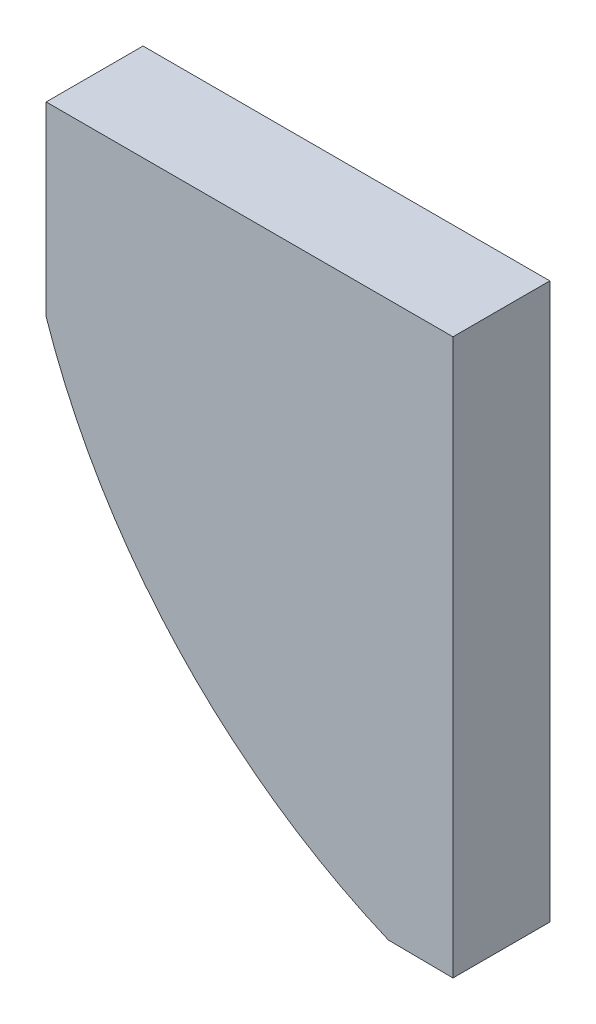
ISO-10303-21;
HEADER;
FILE_DESCRIPTION(('STEP AP214'),'2;1');
FILE_NAME('part.step','',(''),(''),'','','');
FILE_SCHEMA(('AUTOMOTIVE_DESIGN { 1 0 10303 214 1 1 1 1 }'));
ENDSEC;
DATA;
#1=APPLICATION_CONTEXT('core data for automotive mechanical design processes');
#2=APPLICATION_PROTOCOL_DEFINITION('international standard','automotive_design',2000,#1);
#3=PRODUCT_CONTEXT('',#1,'mechanical');
#4=PRODUCT('Part','Part','',(#3));
#5=PRODUCT_RELATED_PRODUCT_CATEGORY('part','',(#4));
#6=PRODUCT_DEFINITION_FORMATION('','',#4);
#7=PRODUCT_DEFINITION_CONTEXT('part definition',#1,'design');
#8=PRODUCT_DEFINITION('design','',#6,#7);
#9=PRODUCT_DEFINITION_SHAPE('','',#8);
#10=(LENGTH_UNIT() NAMED_UNIT(*) SI_UNIT(.MILLI.,.METRE.));
#11=(NAMED_UNIT(*) PLANE_ANGLE_UNIT() SI_UNIT($,.RADIAN.));
#12=(NAMED_UNIT(*) SI_UNIT($,.STERADIAN.) SOLID_ANGLE_UNIT());
#13=UNCERTAINTY_MEASURE_WITH_UNIT(LENGTH_MEASURE(1.E-05),#10,'distance_accuracy_value','');
#14=(GEOMETRIC_REPRESENTATION_CONTEXT(3) GLOBAL_UNCERTAINTY_ASSIGNED_CONTEXT((#13)) GLOBAL_UNIT_ASSIGNED_CONTEXT((#10,
#11,#12)) REPRESENTATION_CONTEXT('',''));
#15=CARTESIAN_POINT('',(0.,0.,0.));
#16=DIRECTION('',(0.,0.,1.));
#17=DIRECTION('',(1.,0.,0.));
#18=AXIS2_PLACEMENT_3D('',#15,#16,#17);
#19=CARTESIAN_POINT('',(-160.92418092877,-159.608706739523,15.));
#20=DIRECTION('',(1.,0.,0.));
#21=DIRECTION('',(0.,1.,0.));
#22=AXIS2_PLACEMENT_3D('',#19,#20,#21);
#23=PLANE('',#22);
#24=DIRECTION('',(0.,-1.,0.));
#25=VECTOR('',#24,1.);
#26=CARTESIAN_POINT('',(-160.92418092877,-159.608706739523,0.));
#27=LINE('',#26,#25);
#28=CARTESIAN_POINT('',(-160.92418092877,-159.608706739523,0.));
#29=VERTEX_POINT('',#28);
#30=CARTESIAN_POINT('',(-160.92418092877,-188.436332042505,0.));
#31=VERTEX_POINT('',#30);
#32=EDGE_CURVE('E120',#29,#31,#27,.T.);
#33=ORIENTED_EDGE('',*,*,#32,.T.);
#34=DIRECTION('',(0.,0.,-1.));
#35=VECTOR('',#34,1.);
#36=CARTESIAN_POINT('',(-160.92418092877,-188.436332042505,15.));
#37=LINE('',#36,#35);
#38=CARTESIAN_POINT('',(-160.92418092877,-188.436332042505,15.));
#39=VERTEX_POINT('',#38);
#40=EDGE_CURVE('E11',#39,#31,#37,.T.);
#41=ORIENTED_EDGE('',*,*,#40,.F.);
#42=DIRECTION('',(0.,-1.,0.));
#43=VECTOR('',#42,1.);
#44=CARTESIAN_POINT('',(-160.92418092877,-159.608706739523,15.));
#45=LINE('',#44,#43);
#46=CARTESIAN_POINT('',(-160.92418092877,-159.608706739523,15.));
#47=VERTEX_POINT('',#46);
#48=EDGE_CURVE('E114',#47,#39,#45,.T.);
#49=ORIENTED_EDGE('',*,*,#48,.F.);
#50=DIRECTION('',(0.,0.,-1.));
#51=VECTOR('',#50,1.);
#52=CARTESIAN_POINT('',(-160.92418092877,-159.608706739523,15.));
#53=LINE('',#52,#51);
#54=EDGE_CURVE('E119',#47,#29,#53,.T.);
#55=ORIENTED_EDGE('',*,*,#54,.T.);
#56=EDGE_LOOP('',(#33,#41,#49,#55));
#57=FACE_BOUND('',#56,.T.);
#58=ADVANCED_FACE('F33',(#57),#23,.F.);
#59=CARTESIAN_POINT('',(-70.9241809287697,-158.022519391014,15.));
#60=DIRECTION('',(0.,0.,-1.));
#61=DIRECTION('',(-1.,0.,0.));
#62=AXIS2_PLACEMENT_3D('',#59,#60,#61);
#63=CYLINDRICAL_SURFACE('',#62,95.);
#64=CARTESIAN_POINT('',(-70.9241809287697,-158.022519391014,0.));
#65=DIRECTION('',(0.,0.,1.));
#66=DIRECTION('',(1.,0.,0.));
#67=AXIS2_PLACEMENT_3D('',#64,#65,#66);
#68=CIRCLE('',#67,95.);
#69=CARTESIAN_POINT('',(-107.92418092877,-245.521090807923,0.));
#70=VERTEX_POINT('',#69);
#71=EDGE_CURVE('E123',#31,#70,#68,.T.);
#72=ORIENTED_EDGE('',*,*,#71,.T.);
#73=DIRECTION('',(0.,0.,-1.));
#74=VECTOR('',#73,1.);
#75=CARTESIAN_POINT('',(-107.92418092877,-245.521090807923,15.));
#76=LINE('',#75,#74);
#77=CARTESIAN_POINT('',(-107.92418092877,-245.521090807923,15.));
#78=VERTEX_POINT('',#77);
#79=EDGE_CURVE('E40',#78,#70,#76,.T.);
#80=ORIENTED_EDGE('',*,*,#79,.F.);
#81=CARTESIAN_POINT('',(-70.9241809287697,-158.022519391014,15.));
#82=DIRECTION('',(0.,0.,1.));
#83=DIRECTION('',(1.,0.,0.));
#84=AXIS2_PLACEMENT_3D('',#81,#82,#83);
#85=CIRCLE('',#84,95.);
#86=EDGE_CURVE('E88',#39,#78,#85,.T.);
#87=ORIENTED_EDGE('',*,*,#86,.F.);
#88=ORIENTED_EDGE('',*,*,#40,.T.);
#89=EDGE_LOOP('',(#72,#80,#87,#88));
#90=FACE_BOUND('',#89,.T.);
#91=ADVANCED_FACE('F132',(#90),#63,.T.);
#92=CARTESIAN_POINT('',(-97.9241809287696,-245.608706739523,15.));
#93=DIRECTION('',(-0.00876125688520129,-0.999961619452362,0.));
#94=DIRECTION('',(0.999961619452363,-0.00876125688520129,0.));
#95=AXIS2_PLACEMENT_3D('',#92,#93,#94);
#96=PLANE('',#95);
#97=DIRECTION('',(-0.999961619452363,0.00876125688520129,0.));
#98=VECTOR('',#97,1.);
#99=CARTESIAN_POINT('',(-97.9241809287696,-245.608706739523,0.));
#100=LINE('',#99,#98);
#101=CARTESIAN_POINT('',(-97.9241809287696,-245.608706739523,0.));
#102=VERTEX_POINT('',#101);
#103=EDGE_CURVE('E103',#102,#70,#100,.T.);
#104=ORIENTED_EDGE('',*,*,#103,.F.);
#105=DIRECTION('',(0.,0.,-1.));
#106=VECTOR('',#105,1.);
#107=CARTESIAN_POINT('',(-97.9241809287696,-245.608706739523,15.));
#108=LINE('',#107,#106);
#109=CARTESIAN_POINT('',(-97.9241809287696,-245.608706739523,15.));
#110=VERTEX_POINT('',#109);
#111=EDGE_CURVE('E97',#110,#102,#108,.T.);
#112=ORIENTED_EDGE('',*,*,#111,.F.);
#113=DIRECTION('',(-0.999961619452363,0.00876125688520129,0.));
#114=VECTOR('',#113,1.);
#115=CARTESIAN_POINT('',(-97.9241809287696,-245.608706739523,15.));
#116=LINE('',#115,#114);
#117=EDGE_CURVE('E101',#110,#78,#116,.T.);
#118=ORIENTED_EDGE('',*,*,#117,.T.);
#119=ORIENTED_EDGE('',*,*,#79,.T.);
#120=EDGE_LOOP('',(#104,#112,#118,#119));
#121=FACE_BOUND('',#120,.T.);
#122=ADVANCED_FACE('F99',(#121),#96,.T.);
#123=CARTESIAN_POINT('',(-97.9241809287696,-245.608706739523,15.));
#124=DIRECTION('',(-1.,0.,0.));
#125=DIRECTION('',(0.,-1.,0.));
#126=AXIS2_PLACEMENT_3D('',#123,#124,#125);
#127=PLANE('',#126);
#128=DIRECTION('',(0.,1.,0.));
#129=VECTOR('',#128,1.);
#130=CARTESIAN_POINT('',(-97.9241809287696,-245.608706739523,0.));
#131=LINE('',#130,#129);
#132=CARTESIAN_POINT('',(-97.9241809287696,-159.608706739523,0.));
#133=VERTEX_POINT('',#132);
#134=EDGE_CURVE('E128',#102,#133,#131,.T.);
#135=ORIENTED_EDGE('',*,*,#134,.T.);
#136=DIRECTION('',(0.,0.,-1.));
#137=VECTOR('',#136,1.);
#138=CARTESIAN_POINT('',(-97.9241809287696,-159.608706739523,15.));
#139=LINE('',#138,#137);
#140=CARTESIAN_POINT('',(-97.9241809287696,-159.608706739523,15.));
#141=VERTEX_POINT('',#140);
#142=EDGE_CURVE('E106',#141,#133,#139,.T.);
#143=ORIENTED_EDGE('',*,*,#142,.F.);
#144=DIRECTION('',(0.,1.,0.));
#145=VECTOR('',#144,1.);
#146=CARTESIAN_POINT('',(-97.9241809287696,-245.608706739523,15.));
#147=LINE('',#146,#145);
#148=EDGE_CURVE('E109',#110,#141,#147,.T.);
#149=ORIENTED_EDGE('',*,*,#148,.F.);
#150=ORIENTED_EDGE('',*,*,#111,.T.);
#151=EDGE_LOOP('',(#135,#143,#149,#150));
#152=FACE_BOUND('',#151,.T.);
#153=ADVANCED_FACE('F110',(#152),#127,.F.);
#154=CARTESIAN_POINT('',(-97.9241809287696,-159.608706739523,15.));
#155=DIRECTION('',(0.,-1.,0.));
#156=DIRECTION('',(0.,0.,-1.));
#157=AXIS2_PLACEMENT_3D('',#154,#155,#156);
#158=PLANE('',#157);
#159=DIRECTION('',(-1.,0.,0.));
#160=VECTOR('',#159,1.);
#161=CARTESIAN_POINT('',(-97.9241809287696,-159.608706739523,0.));
#162=LINE('',#161,#160);
#163=EDGE_CURVE('E80',#133,#29,#162,.T.);
#164=ORIENTED_EDGE('',*,*,#163,.T.);
#165=ORIENTED_EDGE('',*,*,#54,.F.);
#166=DIRECTION('',(-1.,0.,0.));
#167=VECTOR('',#166,1.);
#168=CARTESIAN_POINT('',(-97.9241809287696,-159.608706739523,15.));
#169=LINE('',#168,#167);
#170=EDGE_CURVE('E56',#141,#47,#169,.T.);
#171=ORIENTED_EDGE('',*,*,#170,.F.);
#172=ORIENTED_EDGE('',*,*,#142,.T.);
#173=EDGE_LOOP('',(#164,#165,#171,#172));
#174=FACE_BOUND('',#173,.T.);
#175=ADVANCED_FACE('F137',(#174),#158,.F.);
#176=CARTESIAN_POINT('',(-70.9241809287697,-158.022519391014,15.));
#177=DIRECTION('',(0.,0.,1.));
#178=DIRECTION('',(1.,0.,0.));
#179=AXIS2_PLACEMENT_3D('',#176,#177,#178);
#180=PLANE('',#179);
#181=ORIENTED_EDGE('',*,*,#48,.T.);
#182=ORIENTED_EDGE('',*,*,#86,.T.);
#183=ORIENTED_EDGE('',*,*,#117,.F.);
#184=ORIENTED_EDGE('',*,*,#148,.T.);
#185=ORIENTED_EDGE('',*,*,#170,.T.);
#186=EDGE_LOOP('',(#181,#182,#183,#184,#185));
#187=FACE_BOUND('',#186,.T.);
#188=ADVANCED_FACE('F112',(#187),#180,.T.);
#189=CARTESIAN_POINT('',(-70.9241809287697,-158.022519391014,0.));
#190=DIRECTION('',(0.,0.,1.));
#191=DIRECTION('',(1.,0.,0.));
#192=AXIS2_PLACEMENT_3D('',#189,#190,#191);
#193=PLANE('',#192);
#194=DIRECTION('',(-1.,0.,0.));
#195=VECTOR('',#194,1.);
#196=CARTESIAN_POINT('',(-97.9241809287696,-164.608706739523,0.));
#197=LINE('',#196,#195);
#198=CARTESIAN_POINT('',(-102.92418092877,-164.608706739523,0.));
#199=VERTEX_POINT('',#198);
#200=CARTESIAN_POINT('',(-155.92418092877,-164.608706739523,0.));
#201=VERTEX_POINT('',#200);
#202=EDGE_CURVE('E149',#199,#201,#197,.T.);
#203=ORIENTED_EDGE('',*,*,#202,.T.);
#204=DIRECTION('',(0.,-1.,0.));
#205=VECTOR('',#204,1.);
#206=CARTESIAN_POINT('',(-155.92418092877,-159.608706739523,0.));
#207=LINE('',#206,#205);
#208=CARTESIAN_POINT('',(-155.92418092877,-187.602918306512,0.));
#209=VERTEX_POINT('',#208);
#210=EDGE_CURVE('E144',#201,#209,#207,.T.);
#211=ORIENTED_EDGE('',*,*,#210,.T.);
#212=CARTESIAN_POINT('',(-70.9241809287697,-158.022519391014,0.));
#213=DIRECTION('',(0.,0.,1.));
#214=DIRECTION('',(1.,0.,0.));
#215=AXIS2_PLACEMENT_3D('',#212,#213,#214);
#216=CIRCLE('',#215,90.);
#217=CARTESIAN_POINT('',(-106.875555950009,-240.530086523261,0.));
#218=VERTEX_POINT('',#217);
#219=EDGE_CURVE('E141',#209,#218,#216,.T.);
#220=ORIENTED_EDGE('',*,*,#219,.T.);
#221=DIRECTION('',(-0.999961619452363,0.00876125688520129,0.));
#222=VECTOR('',#221,1.);
#223=CARTESIAN_POINT('',(-97.8803746443436,-240.608898642261,0.));
#224=LINE('',#223,#222);
#225=CARTESIAN_POINT('',(-102.92418092877,-240.564706863619,0.));
#226=VERTEX_POINT('',#225);
#227=EDGE_CURVE('E47',#226,#218,#224,.T.);
#228=ORIENTED_EDGE('',*,*,#227,.F.);
#229=DIRECTION('',(0.,1.,0.));
#230=VECTOR('',#229,1.);
#231=CARTESIAN_POINT('',(-102.92418092877,-245.608706739523,0.));
#232=LINE('',#231,#230);
#233=EDGE_CURVE('E146',#226,#199,#232,.T.);
#234=ORIENTED_EDGE('',*,*,#233,.T.);
#235=EDGE_LOOP('',(#203,#211,#220,#228,#234));
#236=FACE_BOUND('',#235,.T.);
#237=ORIENTED_EDGE('',*,*,#32,.F.);
#238=ORIENTED_EDGE('',*,*,#163,.F.);
#239=ORIENTED_EDGE('',*,*,#134,.F.);
#240=ORIENTED_EDGE('',*,*,#103,.T.);
#241=ORIENTED_EDGE('',*,*,#71,.F.);
#242=EDGE_LOOP('',(#237,#238,#239,#240,#241));
#243=FACE_BOUND('',#242,.T.);
#244=ADVANCED_FACE('F136',(#236,#243),#193,.F.);
#245=CARTESIAN_POINT('',(-155.92418092877,-159.608706739523,15.));
#246=DIRECTION('',(1.,0.,0.));
#247=DIRECTION('',(0.,1.,0.));
#248=AXIS2_PLACEMENT_3D('',#245,#246,#247);
#249=PLANE('',#248);
#250=ORIENTED_EDGE('',*,*,#210,.F.);
#251=DIRECTION('',(0.,0.,-1.));
#252=VECTOR('',#251,1.);
#253=CARTESIAN_POINT('',(-155.92418092877,-164.608706739523,15.));
#254=LINE('',#253,#252);
#255=CARTESIAN_POINT('',(-155.92418092877,-164.608706739523,10.));
#256=VERTEX_POINT('',#255);
#257=EDGE_CURVE('E158',#256,#201,#254,.T.);
#258=ORIENTED_EDGE('',*,*,#257,.F.);
#259=DIRECTION('',(0.,-1.,0.));
#260=VECTOR('',#259,1.);
#261=CARTESIAN_POINT('',(-155.92418092877,-159.608706739523,10.));
#262=LINE('',#261,#260);
#263=CARTESIAN_POINT('',(-155.92418092877,-187.602918306512,10.));
#264=VERTEX_POINT('',#263);
#265=EDGE_CURVE('E152',#256,#264,#262,.T.);
#266=ORIENTED_EDGE('',*,*,#265,.T.);
#267=DIRECTION('',(0.,0.,-1.));
#268=VECTOR('',#267,1.);
#269=CARTESIAN_POINT('',(-155.92418092877,-187.602918306512,10.));
#270=LINE('',#269,#268);
#271=EDGE_CURVE('E124',#264,#209,#270,.T.);
#272=ORIENTED_EDGE('',*,*,#271,.T.);
#273=EDGE_LOOP('',(#250,#258,#266,#272));
#274=FACE_BOUND('',#273,.T.);
#275=ADVANCED_FACE('F183',(#274),#249,.T.);
#276=CARTESIAN_POINT('',(-70.9241809287697,-158.022519391014,15.));
#277=DIRECTION('',(0.,0.,-1.));
#278=DIRECTION('',(-1.,0.,0.));
#279=AXIS2_PLACEMENT_3D('',#276,#277,#278);
#280=CYLINDRICAL_SURFACE('',#279,90.);
#281=ORIENTED_EDGE('',*,*,#219,.F.);
#282=ORIENTED_EDGE('',*,*,#271,.F.);
#283=CARTESIAN_POINT('',(-70.9241809287697,-158.022519391014,10.));
#284=DIRECTION('',(0.,0.,1.));
#285=DIRECTION('',(1.,0.,0.));
#286=AXIS2_PLACEMENT_3D('',#283,#284,#285);
#287=CIRCLE('',#286,90.);
#288=CARTESIAN_POINT('',(-106.875555950009,-240.530086523261,10.));
#289=VERTEX_POINT('',#288);
#290=EDGE_CURVE('E169',#264,#289,#287,.T.);
#291=ORIENTED_EDGE('',*,*,#290,.T.);
#292=DIRECTION('',(0.,0.,-1.));
#293=VECTOR('',#292,1.);
#294=CARTESIAN_POINT('',(-106.875555950009,-240.530086523261,10.));
#295=LINE('',#294,#293);
#296=EDGE_CURVE('E171',#289,#218,#295,.T.);
#297=ORIENTED_EDGE('',*,*,#296,.T.);
#298=EDGE_LOOP('',(#281,#282,#291,#297));
#299=FACE_BOUND('',#298,.T.);
#300=ADVANCED_FACE('F216',(#299),#280,.F.);
#301=CARTESIAN_POINT('',(-97.8803746443436,-240.608898642261,15.));
#302=DIRECTION('',(-0.00876125688520129,-0.999961619452362,0.));
#303=DIRECTION('',(0.999961619452363,-0.00876125688520129,0.));
#304=AXIS2_PLACEMENT_3D('',#301,#302,#303);
#305=PLANE('',#304);
#306=ORIENTED_EDGE('',*,*,#227,.T.);
#307=ORIENTED_EDGE('',*,*,#296,.F.);
#308=DIRECTION('',(-0.999961619452363,0.00876125688520129,0.));
#309=VECTOR('',#308,1.);
#310=CARTESIAN_POINT('',(-97.8803746443436,-240.608898642261,10.));
#311=LINE('',#310,#309);
#312=CARTESIAN_POINT('',(-102.92418092877,-240.564706863619,10.));
#313=VERTEX_POINT('',#312);
#314=EDGE_CURVE('E162',#313,#289,#311,.T.);
#315=ORIENTED_EDGE('',*,*,#314,.F.);
#316=DIRECTION('',(0.,0.,-1.));
#317=VECTOR('',#316,1.);
#318=CARTESIAN_POINT('',(-102.92418092877,-240.564706863619,15.));
#319=LINE('',#318,#317);
#320=EDGE_CURVE('E166',#313,#226,#319,.T.);
#321=ORIENTED_EDGE('',*,*,#320,.T.);
#322=EDGE_LOOP('',(#306,#307,#315,#321));
#323=FACE_BOUND('',#322,.T.);
#324=ADVANCED_FACE('F217',(#323),#305,.F.);
#325=CARTESIAN_POINT('',(-102.92418092877,-245.608706739523,15.));
#326=DIRECTION('',(-1.,0.,0.));
#327=DIRECTION('',(0.,-1.,0.));
#328=AXIS2_PLACEMENT_3D('',#325,#326,#327);
#329=PLANE('',#328);
#330=ORIENTED_EDGE('',*,*,#233,.F.);
#331=ORIENTED_EDGE('',*,*,#320,.F.);
#332=DIRECTION('',(0.,1.,0.));
#333=VECTOR('',#332,1.);
#334=CARTESIAN_POINT('',(-102.92418092877,-245.608706739523,10.));
#335=LINE('',#334,#333);
#336=CARTESIAN_POINT('',(-102.92418092877,-164.608706739523,10.));
#337=VERTEX_POINT('',#336);
#338=EDGE_CURVE('E159',#313,#337,#335,.T.);
#339=ORIENTED_EDGE('',*,*,#338,.T.);
#340=DIRECTION('',(0.,0.,-1.));
#341=VECTOR('',#340,1.);
#342=CARTESIAN_POINT('',(-102.92418092877,-164.608706739523,15.));
#343=LINE('',#342,#341);
#344=EDGE_CURVE('E163',#337,#199,#343,.T.);
#345=ORIENTED_EDGE('',*,*,#344,.T.);
#346=EDGE_LOOP('',(#330,#331,#339,#345));
#347=FACE_BOUND('',#346,.T.);
#348=ADVANCED_FACE('F218',(#347),#329,.T.);
#349=CARTESIAN_POINT('',(-97.9241809287696,-164.608706739523,15.));
#350=DIRECTION('',(0.,-1.,0.));
#351=DIRECTION('',(0.,0.,-1.));
#352=AXIS2_PLACEMENT_3D('',#349,#350,#351);
#353=PLANE('',#352);
#354=ORIENTED_EDGE('',*,*,#202,.F.);
#355=ORIENTED_EDGE('',*,*,#344,.F.);
#356=DIRECTION('',(-1.,0.,0.));
#357=VECTOR('',#356,1.);
#358=CARTESIAN_POINT('',(-97.9241809287696,-164.608706739523,10.));
#359=LINE('',#358,#357);
#360=EDGE_CURVE('E155',#337,#256,#359,.T.);
#361=ORIENTED_EDGE('',*,*,#360,.T.);
#362=ORIENTED_EDGE('',*,*,#257,.T.);
#363=EDGE_LOOP('',(#354,#355,#361,#362));
#364=FACE_BOUND('',#363,.T.);
#365=ADVANCED_FACE('F198',(#364),#353,.T.);
#366=CARTESIAN_POINT('',(-70.9241809287697,-158.022519391014,10.));
#367=DIRECTION('',(0.,0.,1.));
#368=DIRECTION('',(1.,0.,0.));
#369=AXIS2_PLACEMENT_3D('',#366,#367,#368);
#370=PLANE('',#369);
#371=ORIENTED_EDGE('',*,*,#265,.F.);
#372=ORIENTED_EDGE('',*,*,#360,.F.);
#373=ORIENTED_EDGE('',*,*,#338,.F.);
#374=ORIENTED_EDGE('',*,*,#314,.T.);
#375=ORIENTED_EDGE('',*,*,#290,.F.);
#376=EDGE_LOOP('',(#371,#372,#373,#374,#375));
#377=FACE_BOUND('',#376,.T.);
#378=ADVANCED_FACE('F213',(#377),#370,.F.);
#379=CLOSED_SHELL('',(#58,#91,#122,#153,#175,#188,#244,#275,#300,#324,#348,#365,#378));
#380=MANIFOLD_SOLID_BREP('B2',#379);
#381=ADVANCED_BREP_SHAPE_REPRESENTATION('',(#18,#380),#14);
#382=SHAPE_DEFINITION_REPRESENTATION(#9,#381);
ENDSEC;
END-ISO-10303-21;
